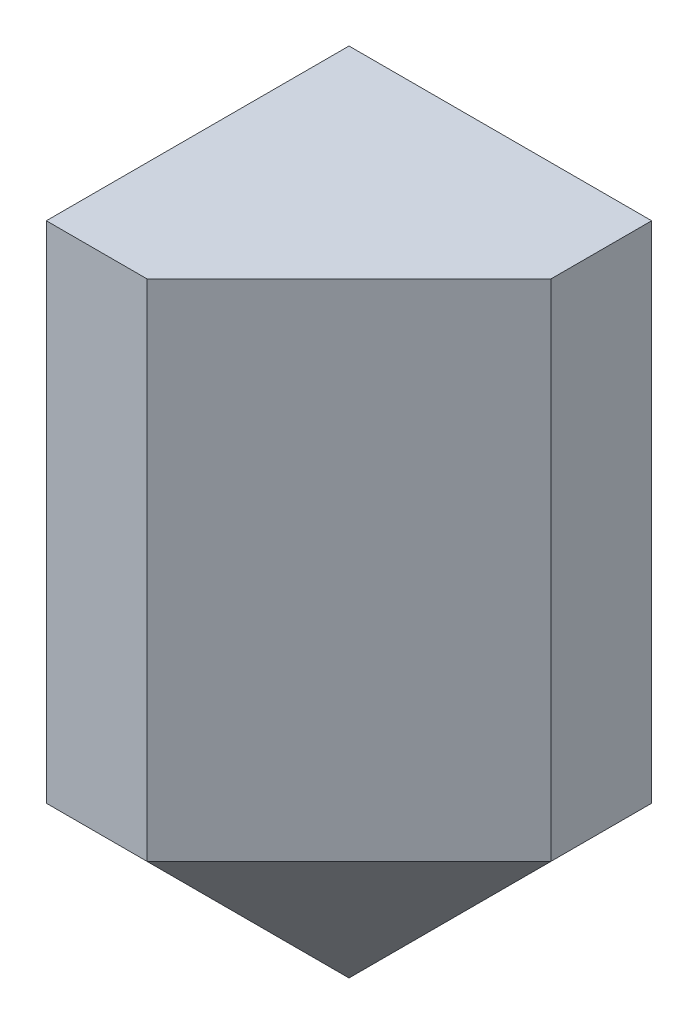
ISO-10303-21;
HEADER;
FILE_DESCRIPTION(('STEP AP214'),'2;1');
FILE_NAME('part.step','',(''),(''),'','','');
FILE_SCHEMA(('AUTOMOTIVE_DESIGN { 1 0 10303 214 1 1 1 1 }'));
ENDSEC;
DATA;
#1=APPLICATION_CONTEXT('core data for automotive mechanical design processes');
#2=APPLICATION_PROTOCOL_DEFINITION('international standard','automotive_design',2000,#1);
#3=PRODUCT_CONTEXT('',#1,'mechanical');
#4=PRODUCT('Part','Part','',(#3));
#5=PRODUCT_RELATED_PRODUCT_CATEGORY('part','',(#4));
#6=PRODUCT_DEFINITION_FORMATION('','',#4);
#7=PRODUCT_DEFINITION_CONTEXT('part definition',#1,'design');
#8=PRODUCT_DEFINITION('design','',#6,#7);
#9=PRODUCT_DEFINITION_SHAPE('','',#8);
#10=(LENGTH_UNIT() NAMED_UNIT(*) SI_UNIT(.MILLI.,.METRE.));
#11=(NAMED_UNIT(*) PLANE_ANGLE_UNIT() SI_UNIT($,.RADIAN.));
#12=(NAMED_UNIT(*) SI_UNIT($,.STERADIAN.) SOLID_ANGLE_UNIT());
#13=UNCERTAINTY_MEASURE_WITH_UNIT(LENGTH_MEASURE(1.E-05),#10,'distance_accuracy_value','');
#14=(GEOMETRIC_REPRESENTATION_CONTEXT(3) GLOBAL_UNCERTAINTY_ASSIGNED_CONTEXT((#13)) GLOBAL_UNIT_ASSIGNED_CONTEXT((#10,
#11,#12)) REPRESENTATION_CONTEXT('',''));
#15=CARTESIAN_POINT('',(0.,0.,0.));
#16=DIRECTION('',(0.,0.,1.));
#17=DIRECTION('',(1.,0.,0.));
#18=AXIS2_PLACEMENT_3D('',#15,#16,#17);
#19=CARTESIAN_POINT('',(0.,0.,30.));
#20=DIRECTION('',(1.,0.,0.));
#21=DIRECTION('',(0.,0.,-1.));
#22=AXIS2_PLACEMENT_3D('',#19,#20,#21);
#23=PLANE('',#22);
#24=CARTESIAN_POINT('',(0.,55.,15.));
#25=DIRECTION('',(-1.,0.,0.));
#26=DIRECTION('',(0.,0.,1.));
#27=AXIS2_PLACEMENT_3D('',#24,#25,#26);
#28=CIRCLE('',#27,10.);
#29=CARTESIAN_POINT('',(0.,55.,25.));
#30=VERTEX_POINT('',#29);
#31=EDGE_CURVE('E437',#30,#30,#28,.T.);
#32=ORIENTED_EDGE('',*,*,#31,.F.);
#33=EDGE_LOOP('',(#32));
#34=FACE_BOUND('',#33,.T.);
#35=CARTESIAN_POINT('',(0.,20.,18.));
#36=DIRECTION('',(-1.,0.,0.));
#37=DIRECTION('',(0.,0.,1.));
#38=AXIS2_PLACEMENT_3D('',#35,#36,#37);
#39=CIRCLE('',#38,2.75);
#40=CARTESIAN_POINT('',(0.,20.,20.75));
#41=VERTEX_POINT('',#40);
#42=EDGE_CURVE('E125',#41,#41,#39,.T.);
#43=ORIENTED_EDGE('',*,*,#42,.F.);
#44=EDGE_LOOP('',(#43));
#45=FACE_BOUND('',#44,.T.);
#46=DIRECTION('',(0.,0.,-1.));
#47=VECTOR('',#46,1.);
#48=CARTESIAN_POINT('',(0.,0.,30.));
#49=LINE('',#48,#47);
#50=CARTESIAN_POINT('',(0.,0.,9.99999999999995));
#51=VERTEX_POINT('',#50);
#52=CARTESIAN_POINT('',(0.,0.,0.));
#53=VERTEX_POINT('',#52);
#54=EDGE_CURVE('E150',#51,#53,#49,.T.);
#55=ORIENTED_EDGE('',*,*,#54,.F.);
#56=DIRECTION('',(0.,-0.707106781186546,-0.707106781186549));
#57=VECTOR('',#56,1.);
#58=CARTESIAN_POINT('',(0.,20.,30.));
#59=LINE('',#58,#57);
#60=CARTESIAN_POINT('',(0.,20.,30.));
#61=VERTEX_POINT('',#60);
#62=EDGE_CURVE('E11',#51,#61,#59,.F.);
#63=ORIENTED_EDGE('',*,*,#62,.T.);
#64=DIRECTION('',(0.,-1.,0.));
#65=VECTOR('',#64,1.);
#66=CARTESIAN_POINT('',(0.,0.,30.));
#67=LINE('',#66,#65);
#68=CARTESIAN_POINT('',(0.,70.,30.));
#69=VERTEX_POINT('',#68);
#70=EDGE_CURVE('E147',#69,#61,#67,.T.);
#71=ORIENTED_EDGE('',*,*,#70,.F.);
#72=DIRECTION('',(0.,0.,1.));
#73=VECTOR('',#72,1.);
#74=CARTESIAN_POINT('',(0.,70.,30.));
#75=LINE('',#74,#73);
#76=CARTESIAN_POINT('',(0.,70.,0.));
#77=VERTEX_POINT('',#76);
#78=EDGE_CURVE('E131',#77,#69,#75,.T.);
#79=ORIENTED_EDGE('',*,*,#78,.F.);
#80=DIRECTION('',(0.,-1.,0.));
#81=VECTOR('',#80,1.);
#82=CARTESIAN_POINT('',(0.,0.,0.));
#83=LINE('',#82,#81);
#84=EDGE_CURVE('E152',#77,#53,#83,.T.);
#85=ORIENTED_EDGE('',*,*,#84,.T.);
#86=EDGE_LOOP('',(#55,#63,#71,#79,#85));
#87=FACE_BOUND('',#86,.T.);
#88=ADVANCED_FACE('F39',(#34,#45,#87),#23,.F.);
#89=CARTESIAN_POINT('',(0.,0.,30.));
#90=DIRECTION('',(0.,1.,0.));
#91=DIRECTION('',(0.,0.,1.));
#92=AXIS2_PLACEMENT_3D('',#89,#90,#91);
#93=PLANE('',#92);
#94=DIRECTION('',(1.,0.,0.));
#95=VECTOR('',#94,1.);
#96=CARTESIAN_POINT('',(0.,0.,0.));
#97=LINE('',#96,#95);
#98=CARTESIAN_POINT('',(9.99999999999995,0.,0.));
#99=VERTEX_POINT('',#98);
#100=EDGE_CURVE('E155',#53,#99,#97,.T.);
#101=ORIENTED_EDGE('',*,*,#100,.T.);
#102=DIRECTION('',(0.,0.,1.));
#103=VECTOR('',#102,1.);
#104=CARTESIAN_POINT('',(9.99999999999995,0.,30.));
#105=LINE('',#104,#103);
#106=CARTESIAN_POINT('',(9.99999999999995,0.,9.99999999999995));
#107=VERTEX_POINT('',#106);
#108=EDGE_CURVE('E49',#99,#107,#105,.T.);
#109=ORIENTED_EDGE('',*,*,#108,.T.);
#110=DIRECTION('',(-1.,0.,0.));
#111=VECTOR('',#110,1.);
#112=CARTESIAN_POINT('',(0.,0.,9.99999999999995));
#113=LINE('',#112,#111);
#114=EDGE_CURVE('E60',#107,#51,#113,.T.);
#115=ORIENTED_EDGE('',*,*,#114,.T.);
#116=ORIENTED_EDGE('',*,*,#54,.T.);
#117=EDGE_LOOP('',(#101,#109,#115,#116));
#118=FACE_BOUND('',#117,.T.);
#119=ADVANCED_FACE('F208',(#118),#93,.F.);
#120=CARTESIAN_POINT('',(30.,0.,30.));
#121=DIRECTION('',(-1.,0.,0.));
#122=DIRECTION('',(0.,0.,1.));
#123=AXIS2_PLACEMENT_3D('',#120,#121,#122);
#124=PLANE('',#123);
#125=DIRECTION('',(0.,1.,0.));
#126=VECTOR('',#125,1.);
#127=CARTESIAN_POINT('',(30.,0.,0.));
#128=LINE('',#127,#126);
#129=CARTESIAN_POINT('',(30.,20.,0.));
#130=VERTEX_POINT('',#129);
#131=CARTESIAN_POINT('',(30.,70.,0.));
#132=VERTEX_POINT('',#131);
#133=EDGE_CURVE('E151',#130,#132,#128,.T.);
#134=ORIENTED_EDGE('',*,*,#133,.T.);
#135=DIRECTION('',(0.,0.,-1.));
#136=VECTOR('',#135,1.);
#137=CARTESIAN_POINT('',(30.,70.,0.));
#138=LINE('',#137,#136);
#139=CARTESIAN_POINT('',(30.,70.,9.99999999999992));
#140=VERTEX_POINT('',#139);
#141=EDGE_CURVE('E140',#140,#132,#138,.T.);
#142=ORIENTED_EDGE('',*,*,#141,.F.);
#143=DIRECTION('',(0.,-1.,0.));
#144=VECTOR('',#143,1.);
#145=CARTESIAN_POINT('',(30.,0.,9.99999999999995));
#146=LINE('',#145,#144);
#147=CARTESIAN_POINT('',(30.,20.,9.99999999999995));
#148=VERTEX_POINT('',#147);
#149=EDGE_CURVE('E165',#140,#148,#146,.T.);
#150=ORIENTED_EDGE('',*,*,#149,.T.);
#151=DIRECTION('',(0.,0.,-1.));
#152=VECTOR('',#151,1.);
#153=CARTESIAN_POINT('',(30.,20.,30.));
#154=LINE('',#153,#152);
#155=EDGE_CURVE('E163',#148,#130,#154,.T.);
#156=ORIENTED_EDGE('',*,*,#155,.T.);
#157=EDGE_LOOP('',(#134,#142,#150,#156));
#158=FACE_BOUND('',#157,.T.);
#159=ADVANCED_FACE('F214',(#158),#124,.F.);
#160=CARTESIAN_POINT('',(0.,0.,30.));
#161=DIRECTION('',(0.,0.,-1.));
#162=DIRECTION('',(-1.,0.,0.));
#163=AXIS2_PLACEMENT_3D('',#160,#161,#162);
#164=PLANE('',#163);
#165=DIRECTION('',(1.,0.,0.));
#166=VECTOR('',#165,1.);
#167=CARTESIAN_POINT('',(0.,20.,30.));
#168=LINE('',#167,#166);
#169=CARTESIAN_POINT('',(10.,20.,30.));
#170=VERTEX_POINT('',#169);
#171=EDGE_CURVE('E159',#61,#170,#168,.T.);
#172=ORIENTED_EDGE('',*,*,#171,.T.);
#173=DIRECTION('',(0.,1.,0.));
#174=VECTOR('',#173,1.);
#175=CARTESIAN_POINT('',(10.,0.,30.));
#176=LINE('',#175,#174);
#177=CARTESIAN_POINT('',(9.99999999999999,70.,30.));
#178=VERTEX_POINT('',#177);
#179=EDGE_CURVE('E161',#170,#178,#176,.T.);
#180=ORIENTED_EDGE('',*,*,#179,.T.);
#181=DIRECTION('',(1.,0.,0.));
#182=VECTOR('',#181,1.);
#183=CARTESIAN_POINT('',(9.99999999999999,70.,30.));
#184=LINE('',#183,#182);
#185=EDGE_CURVE('E134',#69,#178,#184,.T.);
#186=ORIENTED_EDGE('',*,*,#185,.F.);
#187=ORIENTED_EDGE('',*,*,#70,.T.);
#188=EDGE_LOOP('',(#172,#180,#186,#187));
#189=FACE_BOUND('',#188,.T.);
#190=ADVANCED_FACE('F188',(#189),#164,.F.);
#191=CARTESIAN_POINT('',(0.,0.,0.));
#192=DIRECTION('',(0.,0.,-1.));
#193=DIRECTION('',(-1.,0.,0.));
#194=AXIS2_PLACEMENT_3D('',#191,#192,#193);
#195=PLANE('',#194);
#196=CARTESIAN_POINT('',(18.,20.,0.));
#197=DIRECTION('',(0.,0.,-1.));
#198=DIRECTION('',(-1.,0.,0.));
#199=AXIS2_PLACEMENT_3D('',#196,#197,#198);
#200=CIRCLE('',#199,2.74999999999999);
#201=CARTESIAN_POINT('',(15.25,20.,0.));
#202=VERTEX_POINT('',#201);
#203=EDGE_CURVE('E113',#202,#202,#200,.T.);
#204=ORIENTED_EDGE('',*,*,#203,.F.);
#205=EDGE_LOOP('',(#204));
#206=FACE_BOUND('',#205,.T.);
#207=CARTESIAN_POINT('',(18.,48.,0.));
#208=DIRECTION('',(0.,0.,-1.));
#209=DIRECTION('',(-1.,0.,0.));
#210=AXIS2_PLACEMENT_3D('',#207,#208,#209);
#211=CIRCLE('',#210,2.74999999999999);
#212=CARTESIAN_POINT('',(15.25,48.,0.));
#213=VERTEX_POINT('',#212);
#214=EDGE_CURVE('E112',#213,#213,#211,.T.);
#215=ORIENTED_EDGE('',*,*,#214,.F.);
#216=EDGE_LOOP('',(#215));
#217=FACE_BOUND('',#216,.T.);
#218=ORIENTED_EDGE('',*,*,#133,.F.);
#219=DIRECTION('',(0.707106781186549,0.707106781186546,0.));
#220=VECTOR('',#219,1.);
#221=CARTESIAN_POINT('',(4.99999999999996,-4.99999999999997,0.));
#222=LINE('',#221,#220);
#223=EDGE_CURVE('E167',#130,#99,#222,.F.);
#224=ORIENTED_EDGE('',*,*,#223,.T.);
#225=ORIENTED_EDGE('',*,*,#100,.F.);
#226=ORIENTED_EDGE('',*,*,#84,.F.);
#227=DIRECTION('',(-1.,0.,0.));
#228=VECTOR('',#227,1.);
#229=CARTESIAN_POINT('',(0.,70.,0.));
#230=LINE('',#229,#228);
#231=EDGE_CURVE('E143',#132,#77,#230,.T.);
#232=ORIENTED_EDGE('',*,*,#231,.F.);
#233=EDGE_LOOP('',(#218,#224,#225,#226,#232));
#234=FACE_BOUND('',#233,.T.);
#235=ADVANCED_FACE('F205',(#206,#217,#234),#195,.T.);
#236=CARTESIAN_POINT('',(30.,20.,30.));
#237=DIRECTION('',(-0.707106781186546,0.707106781186549,0.));
#238=DIRECTION('',(0.,0.,-1.));
#239=AXIS2_PLACEMENT_3D('',#236,#237,#238);
#240=PLANE('',#239);
#241=ORIENTED_EDGE('',*,*,#223,.F.);
#242=ORIENTED_EDGE('',*,*,#155,.F.);
#243=DIRECTION('',(-0.707106781186549,-0.707106781186546,0.));
#244=VECTOR('',#243,1.);
#245=CARTESIAN_POINT('',(30.,20.,9.99999999999995));
#246=LINE('',#245,#244);
#247=EDGE_CURVE('E44',#107,#148,#246,.F.);
#248=ORIENTED_EDGE('',*,*,#247,.F.);
#249=ORIENTED_EDGE('',*,*,#108,.F.);
#250=EDGE_LOOP('',(#241,#242,#248,#249));
#251=FACE_BOUND('',#250,.T.);
#252=ADVANCED_FACE('F42',(#251),#240,.F.);
#253=CARTESIAN_POINT('',(0.,20.,30.));
#254=DIRECTION('',(0.,0.707106781186549,-0.707106781186546));
#255=DIRECTION('',(1.,0.,0.));
#256=AXIS2_PLACEMENT_3D('',#253,#254,#255);
#257=PLANE('',#256);
#258=ORIENTED_EDGE('',*,*,#62,.F.);
#259=ORIENTED_EDGE('',*,*,#114,.F.);
#260=DIRECTION('',(0.,0.707106781186546,0.707106781186549));
#261=VECTOR('',#260,1.);
#262=CARTESIAN_POINT('',(9.99999999999998,10.,20.));
#263=LINE('',#262,#261);
#264=EDGE_CURVE('E172',#170,#107,#263,.F.);
#265=ORIENTED_EDGE('',*,*,#264,.F.);
#266=ORIENTED_EDGE('',*,*,#171,.F.);
#267=EDGE_LOOP('',(#258,#259,#265,#266));
#268=FACE_BOUND('',#267,.T.);
#269=ADVANCED_FACE('F198',(#268),#257,.F.);
#270=CARTESIAN_POINT('',(30.,20.,9.99999999999995));
#271=DIRECTION('',(0.577350269189626,-0.577350269189628,0.577350269189624));
#272=DIRECTION('',(0.707106781186549,0.707106781186546,0.));
#273=AXIS2_PLACEMENT_3D('',#270,#271,#272);
#274=PLANE('',#273);
#275=ORIENTED_EDGE('',*,*,#264,.T.);
#276=ORIENTED_EDGE('',*,*,#247,.T.);
#277=DIRECTION('',(0.707106781186546,0.,-0.707106781186549));
#278=VECTOR('',#277,1.);
#279=CARTESIAN_POINT('',(30.,20.,9.99999999999995));
#280=LINE('',#279,#278);
#281=EDGE_CURVE('E146',#170,#148,#280,.T.);
#282=ORIENTED_EDGE('',*,*,#281,.F.);
#283=EDGE_LOOP('',(#275,#276,#282));
#284=FACE_BOUND('',#283,.T.);
#285=ADVANCED_FACE('F179',(#284),#274,.T.);
#286=CARTESIAN_POINT('',(10.,0.,30.));
#287=DIRECTION('',(-0.707106781186549,0.,-0.707106781186546));
#288=DIRECTION('',(0.,1.,0.));
#289=AXIS2_PLACEMENT_3D('',#286,#287,#288);
#290=PLANE('',#289);
#291=ORIENTED_EDGE('',*,*,#281,.T.);
#292=ORIENTED_EDGE('',*,*,#149,.F.);
#293=DIRECTION('',(0.707106781186546,0.,-0.707106781186549));
#294=VECTOR('',#293,1.);
#295=CARTESIAN_POINT('',(30.,70.,9.99999999999992));
#296=LINE('',#295,#294);
#297=EDGE_CURVE('E137',#178,#140,#296,.T.);
#298=ORIENTED_EDGE('',*,*,#297,.F.);
#299=ORIENTED_EDGE('',*,*,#179,.F.);
#300=EDGE_LOOP('',(#291,#292,#298,#299));
#301=FACE_BOUND('',#300,.T.);
#302=ADVANCED_FACE('F184',(#301),#290,.F.);
#303=CARTESIAN_POINT('',(0.,70.,0.));
#304=DIRECTION('',(0.,-1.,0.));
#305=DIRECTION('',(0.,0.,-1.));
#306=AXIS2_PLACEMENT_3D('',#303,#304,#305);
#307=PLANE('',#306);
#308=ORIENTED_EDGE('',*,*,#78,.T.);
#309=ORIENTED_EDGE('',*,*,#185,.T.);
#310=ORIENTED_EDGE('',*,*,#297,.T.);
#311=ORIENTED_EDGE('',*,*,#141,.T.);
#312=ORIENTED_EDGE('',*,*,#231,.T.);
#313=EDGE_LOOP('',(#308,#309,#310,#311,#312));
#314=FACE_BOUND('',#313,.T.);
#315=ADVANCED_FACE('F191',(#314),#307,.F.);
#316=CARTESIAN_POINT('',(15.,20.,18.));
#317=DIRECTION('',(-1.,0.,0.));
#318=DIRECTION('',(0.,0.,1.));
#319=AXIS2_PLACEMENT_3D('',#316,#317,#318);
#320=CONICAL_SURFACE('',#319,2.74999999999999,1.02974425867665);
#321=CARTESIAN_POINT('',(16.6523667023258,20.,18.));
#322=VERTEX_POINT('',#321);
#323=VERTEX_LOOP('',#322);
#324=FACE_BOUND('',#323,.T.);
#325=CARTESIAN_POINT('',(15.,20.,18.));
#326=DIRECTION('',(-1.,0.,0.));
#327=DIRECTION('',(0.,0.,1.));
#328=AXIS2_PLACEMENT_3D('',#325,#326,#327);
#329=CIRCLE('',#328,2.74999999999999);
#330=CARTESIAN_POINT('',(15.,20.,20.75));
#331=VERTEX_POINT('',#330);
#332=EDGE_CURVE('E128',#331,#331,#329,.T.);
#333=ORIENTED_EDGE('',*,*,#332,.T.);
#334=EDGE_LOOP('',(#333));
#335=FACE_BOUND('',#334,.T.);
#336=ADVANCED_FACE('F234',(#324,#335),#320,.F.);
#337=CARTESIAN_POINT('',(0.,20.,18.));
#338=DIRECTION('',(-1.,0.,0.));
#339=DIRECTION('',(0.,0.,1.));
#340=AXIS2_PLACEMENT_3D('',#337,#338,#339);
#341=CYLINDRICAL_SURFACE('',#340,2.74999999999999);
#342=ORIENTED_EDGE('',*,*,#332,.F.);
#343=EDGE_LOOP('',(#342));
#344=FACE_BOUND('',#343,.T.);
#345=ORIENTED_EDGE('',*,*,#42,.T.);
#346=EDGE_LOOP('',(#345));
#347=FACE_BOUND('',#346,.T.);
#348=ADVANCED_FACE('F239',(#344,#347),#341,.F.);
#349=CARTESIAN_POINT('',(18.,48.,15.));
#350=DIRECTION('',(0.,0.,-1.));
#351=DIRECTION('',(-1.,0.,0.));
#352=AXIS2_PLACEMENT_3D('',#349,#350,#351);
#353=CONICAL_SURFACE('',#352,2.74999999999999,1.02974425867665);
#354=CARTESIAN_POINT('',(18.,48.,16.6523667023258));
#355=VERTEX_POINT('',#354);
#356=VERTEX_LOOP('',#355);
#357=FACE_BOUND('',#356,.T.);
#358=CARTESIAN_POINT('',(18.,48.,15.));
#359=DIRECTION('',(0.,0.,-1.));
#360=DIRECTION('',(-1.,0.,0.));
#361=AXIS2_PLACEMENT_3D('',#358,#359,#360);
#362=CIRCLE('',#361,2.74999999999999);
#363=CARTESIAN_POINT('',(15.25,48.,15.));
#364=VERTEX_POINT('',#363);
#365=EDGE_CURVE('E116',#364,#364,#362,.T.);
#366=ORIENTED_EDGE('',*,*,#365,.T.);
#367=EDGE_LOOP('',(#366));
#368=FACE_BOUND('',#367,.T.);
#369=ADVANCED_FACE('F382',(#357,#368),#353,.F.);
#370=CARTESIAN_POINT('',(18.,48.,0.));
#371=DIRECTION('',(0.,0.,-1.));
#372=DIRECTION('',(-1.,0.,0.));
#373=AXIS2_PLACEMENT_3D('',#370,#371,#372);
#374=CYLINDRICAL_SURFACE('',#373,2.74999999999999);
#375=ORIENTED_EDGE('',*,*,#365,.F.);
#376=EDGE_LOOP('',(#375));
#377=FACE_BOUND('',#376,.T.);
#378=ORIENTED_EDGE('',*,*,#214,.T.);
#379=EDGE_LOOP('',(#378));
#380=FACE_BOUND('',#379,.T.);
#381=ADVANCED_FACE('F106',(#377,#380),#374,.F.);
#382=CARTESIAN_POINT('',(18.,20.,15.));
#383=DIRECTION('',(0.,0.,-1.));
#384=DIRECTION('',(-1.,0.,0.));
#385=AXIS2_PLACEMENT_3D('',#382,#383,#384);
#386=CONICAL_SURFACE('',#385,2.74999999999999,1.02974425867665);
#387=CARTESIAN_POINT('',(18.,20.,16.6523667023258));
#388=VERTEX_POINT('',#387);
#389=VERTEX_LOOP('',#388);
#390=FACE_BOUND('',#389,.T.);
#391=CARTESIAN_POINT('',(18.,20.,15.));
#392=DIRECTION('',(0.,0.,-1.));
#393=DIRECTION('',(-1.,0.,0.));
#394=AXIS2_PLACEMENT_3D('',#391,#392,#393);
#395=CIRCLE('',#394,2.74999999999999);
#396=CARTESIAN_POINT('',(15.25,20.,15.));
#397=VERTEX_POINT('',#396);
#398=EDGE_CURVE('E110',#397,#397,#395,.T.);
#399=ORIENTED_EDGE('',*,*,#398,.T.);
#400=EDGE_LOOP('',(#399));
#401=FACE_BOUND('',#400,.T.);
#402=ADVANCED_FACE('F102',(#390,#401),#386,.F.);
#403=CARTESIAN_POINT('',(18.,20.,0.));
#404=DIRECTION('',(0.,0.,-1.));
#405=DIRECTION('',(-1.,0.,0.));
#406=AXIS2_PLACEMENT_3D('',#403,#404,#405);
#407=CYLINDRICAL_SURFACE('',#406,2.74999999999999);
#408=ORIENTED_EDGE('',*,*,#398,.F.);
#409=EDGE_LOOP('',(#408));
#410=FACE_BOUND('',#409,.T.);
#411=ORIENTED_EDGE('',*,*,#203,.T.);
#412=EDGE_LOOP('',(#411));
#413=FACE_BOUND('',#412,.T.);
#414=ADVANCED_FACE('F105',(#410,#413),#407,.F.);
#415=CARTESIAN_POINT('',(2.,55.,15.));
#416=DIRECTION('',(-1.,0.,0.));
#417=DIRECTION('',(0.,0.,1.));
#418=AXIS2_PLACEMENT_3D('',#415,#416,#417);
#419=CYLINDRICAL_SURFACE('',#418,10.);
#420=CARTESIAN_POINT('',(2.,55.,15.));
#421=DIRECTION('',(-1.,0.,0.));
#422=DIRECTION('',(0.,0.,1.));
#423=AXIS2_PLACEMENT_3D('',#420,#421,#422);
#424=CIRCLE('',#423,10.);
#425=CARTESIAN_POINT('',(2.,55.,25.));
#426=VERTEX_POINT('',#425);
#427=EDGE_CURVE('E119',#426,#426,#424,.T.);
#428=ORIENTED_EDGE('',*,*,#427,.F.);
#429=EDGE_LOOP('',(#428));
#430=FACE_BOUND('',#429,.T.);
#431=ORIENTED_EDGE('',*,*,#31,.T.);
#432=EDGE_LOOP('',(#431));
#433=FACE_BOUND('',#432,.T.);
#434=ADVANCED_FACE('F344',(#430,#433),#419,.F.);
#435=CARTESIAN_POINT('',(2.,55.,15.));
#436=DIRECTION('',(-1.,0.,0.));
#437=DIRECTION('',(0.,0.,1.));
#438=AXIS2_PLACEMENT_3D('',#435,#436,#437);
#439=PLANE('',#438);
#440=ORIENTED_EDGE('',*,*,#427,.T.);
#441=EDGE_LOOP('',(#440));
#442=FACE_BOUND('',#441,.T.);
#443=ADVANCED_FACE('F349',(#442),#439,.T.);
#444=CLOSED_SHELL('',(#88,#119,#159,#190,#235,#252,#269,#285,#302,#315,#336,#348,#369,#381,#402,
#414,#434,#443));
#445=MANIFOLD_SOLID_BREP('B2',#444);
#446=ADVANCED_BREP_SHAPE_REPRESENTATION('',(#18,#445),#14);
#447=SHAPE_DEFINITION_REPRESENTATION(#9,#446);
ENDSEC;
END-ISO-10303-21;
